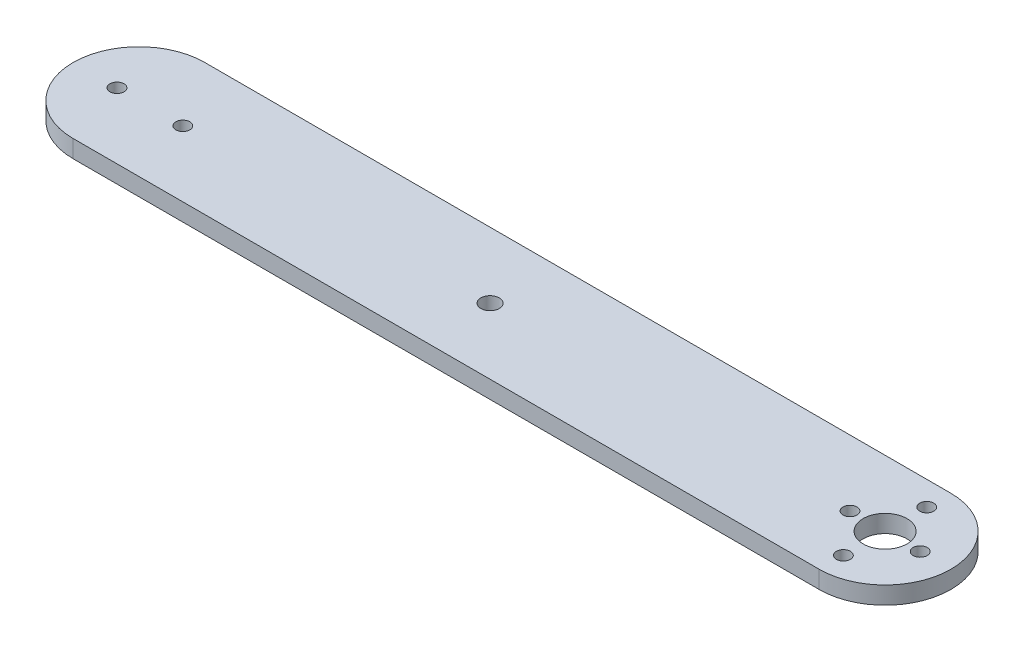
ISO-10303-21;
HEADER;
FILE_DESCRIPTION(('STEP AP214'),'2;1');
FILE_NAME('part.step','',(''),(''),'','','');
FILE_SCHEMA(('AUTOMOTIVE_DESIGN { 1 0 10303 214 1 1 1 1 }'));
ENDSEC;
DATA;
#1=APPLICATION_CONTEXT('core data for automotive mechanical design processes');
#2=APPLICATION_PROTOCOL_DEFINITION('international standard','automotive_design',2000,#1);
#3=PRODUCT_CONTEXT('',#1,'mechanical');
#4=PRODUCT('Part','Part','',(#3));
#5=PRODUCT_RELATED_PRODUCT_CATEGORY('part','',(#4));
#6=PRODUCT_DEFINITION_FORMATION('','',#4);
#7=PRODUCT_DEFINITION_CONTEXT('part definition',#1,'design');
#8=PRODUCT_DEFINITION('design','',#6,#7);
#9=PRODUCT_DEFINITION_SHAPE('','',#8);
#10=(LENGTH_UNIT() NAMED_UNIT(*) SI_UNIT(.MILLI.,.METRE.));
#11=(NAMED_UNIT(*) PLANE_ANGLE_UNIT() SI_UNIT($,.RADIAN.));
#12=(NAMED_UNIT(*) SI_UNIT($,.STERADIAN.) SOLID_ANGLE_UNIT());
#13=UNCERTAINTY_MEASURE_WITH_UNIT(LENGTH_MEASURE(1.E-05),#10,'distance_accuracy_value','');
#14=(GEOMETRIC_REPRESENTATION_CONTEXT(3) GLOBAL_UNCERTAINTY_ASSIGNED_CONTEXT((#13)) GLOBAL_UNIT_ASSIGNED_CONTEXT((#10,
#11,#12)) REPRESENTATION_CONTEXT('',''));
#15=CARTESIAN_POINT('',(0.,0.,0.));
#16=DIRECTION('',(0.,0.,1.));
#17=DIRECTION('',(1.,0.,0.));
#18=AXIS2_PLACEMENT_3D('',#15,#16,#17);
#19=CARTESIAN_POINT('',(0.,4.,0.));
#20=DIRECTION('',(0.,1.,0.));
#21=DIRECTION('',(0.,0.,1.));
#22=AXIS2_PLACEMENT_3D('',#19,#20,#21);
#23=PLANE('',#22);
#24=CARTESIAN_POINT('',(-90.,4.,0.));
#25=DIRECTION('',(0.,1.,0.));
#26=DIRECTION('',(0.,0.,1.));
#27=AXIS2_PLACEMENT_3D('',#24,#25,#26);
#28=CIRCLE('',#27,2.1);
#29=CARTESIAN_POINT('',(-90.,4.,2.1));
#30=VERTEX_POINT('',#29);
#31=EDGE_CURVE('E159',#30,#30,#28,.T.);
#32=ORIENTED_EDGE('',*,*,#31,.F.);
#33=EDGE_LOOP('',(#32));
#34=FACE_BOUND('',#33,.T.);
#35=CARTESIAN_POINT('',(-160.,4.,0.));
#36=DIRECTION('',(0.,1.,0.));
#37=DIRECTION('',(0.,0.,1.));
#38=AXIS2_PLACEMENT_3D('',#35,#36,#37);
#39=CIRCLE('',#38,1.59999999999999);
#40=CARTESIAN_POINT('',(-160.,4.,1.59999999999999));
#41=VERTEX_POINT('',#40);
#42=EDGE_CURVE('E144',#41,#41,#39,.T.);
#43=ORIENTED_EDGE('',*,*,#42,.F.);
#44=EDGE_LOOP('',(#43));
#45=FACE_BOUND('',#44,.T.);
#46=CARTESIAN_POINT('',(0.,4.,9.5));
#47=DIRECTION('',(0.,1.,0.));
#48=DIRECTION('',(0.,0.,1.));
#49=AXIS2_PLACEMENT_3D('',#46,#47,#48);
#50=CIRCLE('',#49,1.6);
#51=CARTESIAN_POINT('',(0.,4.,11.1));
#52=VERTEX_POINT('',#51);
#53=EDGE_CURVE('E134',#52,#52,#50,.T.);
#54=ORIENTED_EDGE('',*,*,#53,.F.);
#55=EDGE_LOOP('',(#54));
#56=FACE_BOUND('',#55,.T.);
#57=CARTESIAN_POINT('',(8.,4.,0.));
#58=DIRECTION('',(0.,1.,0.));
#59=DIRECTION('',(0.,0.,1.));
#60=AXIS2_PLACEMENT_3D('',#57,#58,#59);
#61=CIRCLE('',#60,1.6);
#62=CARTESIAN_POINT('',(8.,4.,1.6));
#63=VERTEX_POINT('',#62);
#64=EDGE_CURVE('E124',#63,#63,#61,.T.);
#65=ORIENTED_EDGE('',*,*,#64,.F.);
#66=EDGE_LOOP('',(#65));
#67=FACE_BOUND('',#66,.T.);
#68=CARTESIAN_POINT('',(0.,4.,0.));
#69=DIRECTION('',(0.,1.,0.));
#70=DIRECTION('',(0.,0.,1.));
#71=AXIS2_PLACEMENT_3D('',#68,#69,#70);
#72=CIRCLE('',#71,15.);
#73=CARTESIAN_POINT('',(0.,4.,15.));
#74=VERTEX_POINT('',#73);
#75=CARTESIAN_POINT('',(0.,4.,-15.));
#76=VERTEX_POINT('',#75);
#77=EDGE_CURVE('E93',#74,#76,#72,.T.);
#78=ORIENTED_EDGE('',*,*,#77,.T.);
#79=DIRECTION('',(-1.,0.,0.));
#80=VECTOR('',#79,1.);
#81=CARTESIAN_POINT('',(0.,4.,-15.));
#82=LINE('',#81,#80);
#83=CARTESIAN_POINT('',(-170.,4.,-14.9999999999999));
#84=VERTEX_POINT('',#83);
#85=EDGE_CURVE('E88',#76,#84,#82,.T.);
#86=ORIENTED_EDGE('',*,*,#85,.T.);
#87=CARTESIAN_POINT('',(-170.,4.,0.));
#88=DIRECTION('',(0.,1.,0.));
#89=DIRECTION('',(0.,0.,1.));
#90=AXIS2_PLACEMENT_3D('',#87,#88,#89);
#91=CIRCLE('',#90,15.);
#92=CARTESIAN_POINT('',(-170.,4.,15.));
#93=VERTEX_POINT('',#92);
#94=EDGE_CURVE('E90',#84,#93,#91,.T.);
#95=ORIENTED_EDGE('',*,*,#94,.T.);
#96=DIRECTION('',(1.,0.,0.));
#97=VECTOR('',#96,1.);
#98=CARTESIAN_POINT('',(0.,4.,15.));
#99=LINE('',#98,#97);
#100=EDGE_CURVE('E57',#93,#74,#99,.T.);
#101=ORIENTED_EDGE('',*,*,#100,.T.);
#102=EDGE_LOOP('',(#78,#86,#95,#101));
#103=FACE_BOUND('',#102,.T.);
#104=CARTESIAN_POINT('',(0.,4.,0.));
#105=DIRECTION('',(0.,1.,0.));
#106=DIRECTION('',(0.,0.,1.));
#107=AXIS2_PLACEMENT_3D('',#104,#105,#106);
#108=CIRCLE('',#107,5.);
#109=CARTESIAN_POINT('',(0.,4.,5.));
#110=VERTEX_POINT('',#109);
#111=EDGE_CURVE('E106',#110,#110,#108,.T.);
#112=ORIENTED_EDGE('',*,*,#111,.F.);
#113=EDGE_LOOP('',(#112));
#114=FACE_BOUND('',#113,.T.);
#115=CARTESIAN_POINT('',(0.,4.,-9.5));
#116=DIRECTION('',(0.,1.,0.));
#117=DIRECTION('',(0.,0.,1.));
#118=AXIS2_PLACEMENT_3D('',#115,#116,#117);
#119=CIRCLE('',#118,1.6);
#120=CARTESIAN_POINT('',(0.,4.,-7.9));
#121=VERTEX_POINT('',#120);
#122=EDGE_CURVE('E130',#121,#121,#119,.T.);
#123=ORIENTED_EDGE('',*,*,#122,.F.);
#124=EDGE_LOOP('',(#123));
#125=FACE_BOUND('',#124,.T.);
#126=CARTESIAN_POINT('',(-8.,4.,0.));
#127=DIRECTION('',(0.,1.,0.));
#128=DIRECTION('',(0.,0.,1.));
#129=AXIS2_PLACEMENT_3D('',#126,#127,#128);
#130=CIRCLE('',#129,1.6);
#131=CARTESIAN_POINT('',(-8.,4.,1.6));
#132=VERTEX_POINT('',#131);
#133=EDGE_CURVE('E138',#132,#132,#130,.T.);
#134=ORIENTED_EDGE('',*,*,#133,.F.);
#135=EDGE_LOOP('',(#134));
#136=FACE_BOUND('',#135,.T.);
#137=CARTESIAN_POINT('',(-175.,4.,0.));
#138=DIRECTION('',(0.,1.,0.));
#139=DIRECTION('',(0.,0.,1.));
#140=AXIS2_PLACEMENT_3D('',#137,#138,#139);
#141=CIRCLE('',#140,1.59999999999999);
#142=CARTESIAN_POINT('',(-175.,4.,1.59999999999999));
#143=VERTEX_POINT('',#142);
#144=EDGE_CURVE('E151',#143,#143,#141,.T.);
#145=ORIENTED_EDGE('',*,*,#144,.F.);
#146=EDGE_LOOP('',(#145));
#147=FACE_BOUND('',#146,.T.);
#148=ADVANCED_FACE('F39',(#34,#45,#56,#67,#103,#114,#125,#136,#147),#23,.T.);
#149=CARTESIAN_POINT('',(0.,0.,0.));
#150=DIRECTION('',(0.,1.,0.));
#151=DIRECTION('',(0.,0.,1.));
#152=AXIS2_PLACEMENT_3D('',#149,#150,#151);
#153=PLANE('',#152);
#154=CARTESIAN_POINT('',(-90.,0.,0.));
#155=DIRECTION('',(0.,1.,0.));
#156=DIRECTION('',(0.,0.,1.));
#157=AXIS2_PLACEMENT_3D('',#154,#155,#156);
#158=CIRCLE('',#157,2.1);
#159=CARTESIAN_POINT('',(-90.,0.,2.1));
#160=VERTEX_POINT('',#159);
#161=EDGE_CURVE('E160',#160,#160,#158,.T.);
#162=ORIENTED_EDGE('',*,*,#161,.T.);
#163=EDGE_LOOP('',(#162));
#164=FACE_BOUND('',#163,.T.);
#165=CARTESIAN_POINT('',(0.,0.,0.));
#166=DIRECTION('',(0.,1.,0.));
#167=DIRECTION('',(0.,0.,1.));
#168=AXIS2_PLACEMENT_3D('',#165,#166,#167);
#169=CIRCLE('',#168,15.);
#170=CARTESIAN_POINT('',(0.,0.,15.));
#171=VERTEX_POINT('',#170);
#172=CARTESIAN_POINT('',(0.,0.,-15.));
#173=VERTEX_POINT('',#172);
#174=EDGE_CURVE('E103',#171,#173,#169,.T.);
#175=ORIENTED_EDGE('',*,*,#174,.F.);
#176=DIRECTION('',(1.,0.,0.));
#177=VECTOR('',#176,1.);
#178=CARTESIAN_POINT('',(0.,0.,15.));
#179=LINE('',#178,#177);
#180=CARTESIAN_POINT('',(-170.,0.,15.));
#181=VERTEX_POINT('',#180);
#182=EDGE_CURVE('E76',#181,#171,#179,.T.);
#183=ORIENTED_EDGE('',*,*,#182,.F.);
#184=CARTESIAN_POINT('',(-170.,0.,0.));
#185=DIRECTION('',(0.,1.,0.));
#186=DIRECTION('',(0.,0.,1.));
#187=AXIS2_PLACEMENT_3D('',#184,#185,#186);
#188=CIRCLE('',#187,15.);
#189=CARTESIAN_POINT('',(-170.,0.,-14.9999999999999));
#190=VERTEX_POINT('',#189);
#191=EDGE_CURVE('E71',#190,#181,#188,.T.);
#192=ORIENTED_EDGE('',*,*,#191,.F.);
#193=DIRECTION('',(-1.,0.,0.));
#194=VECTOR('',#193,1.);
#195=CARTESIAN_POINT('',(0.,0.,-15.));
#196=LINE('',#195,#194);
#197=EDGE_CURVE('E92',#173,#190,#196,.T.);
#198=ORIENTED_EDGE('',*,*,#197,.F.);
#199=EDGE_LOOP('',(#175,#183,#192,#198));
#200=FACE_BOUND('',#199,.T.);
#201=CARTESIAN_POINT('',(0.,0.,0.));
#202=DIRECTION('',(0.,1.,0.));
#203=DIRECTION('',(0.,0.,1.));
#204=AXIS2_PLACEMENT_3D('',#201,#202,#203);
#205=CIRCLE('',#204,5.);
#206=CARTESIAN_POINT('',(0.,0.,5.));
#207=VERTEX_POINT('',#206);
#208=EDGE_CURVE('E119',#207,#207,#205,.T.);
#209=ORIENTED_EDGE('',*,*,#208,.T.);
#210=EDGE_LOOP('',(#209));
#211=FACE_BOUND('',#210,.T.);
#212=CARTESIAN_POINT('',(8.,0.,0.));
#213=DIRECTION('',(0.,1.,0.));
#214=DIRECTION('',(0.,0.,1.));
#215=AXIS2_PLACEMENT_3D('',#212,#213,#214);
#216=CIRCLE('',#215,1.6);
#217=CARTESIAN_POINT('',(8.,0.,1.6));
#218=VERTEX_POINT('',#217);
#219=EDGE_CURVE('E123',#218,#218,#216,.T.);
#220=ORIENTED_EDGE('',*,*,#219,.T.);
#221=EDGE_LOOP('',(#220));
#222=FACE_BOUND('',#221,.T.);
#223=CARTESIAN_POINT('',(0.,0.,-9.5));
#224=DIRECTION('',(0.,1.,0.));
#225=DIRECTION('',(0.,0.,1.));
#226=AXIS2_PLACEMENT_3D('',#223,#224,#225);
#227=CIRCLE('',#226,1.6);
#228=CARTESIAN_POINT('',(0.,0.,-7.9));
#229=VERTEX_POINT('',#228);
#230=EDGE_CURVE('E128',#229,#229,#227,.T.);
#231=ORIENTED_EDGE('',*,*,#230,.T.);
#232=EDGE_LOOP('',(#231));
#233=FACE_BOUND('',#232,.T.);
#234=CARTESIAN_POINT('',(0.,0.,9.5));
#235=DIRECTION('',(0.,1.,0.));
#236=DIRECTION('',(0.,0.,1.));
#237=AXIS2_PLACEMENT_3D('',#234,#235,#236);
#238=CIRCLE('',#237,1.6);
#239=CARTESIAN_POINT('',(0.,0.,11.1));
#240=VERTEX_POINT('',#239);
#241=EDGE_CURVE('E139',#240,#240,#238,.T.);
#242=ORIENTED_EDGE('',*,*,#241,.T.);
#243=EDGE_LOOP('',(#242));
#244=FACE_BOUND('',#243,.T.);
#245=CARTESIAN_POINT('',(-8.,0.,0.));
#246=DIRECTION('',(0.,1.,0.));
#247=DIRECTION('',(0.,0.,1.));
#248=AXIS2_PLACEMENT_3D('',#245,#246,#247);
#249=CIRCLE('',#248,1.6);
#250=CARTESIAN_POINT('',(-8.,0.,1.6));
#251=VERTEX_POINT('',#250);
#252=EDGE_CURVE('E142',#251,#251,#249,.T.);
#253=ORIENTED_EDGE('',*,*,#252,.T.);
#254=EDGE_LOOP('',(#253));
#255=FACE_BOUND('',#254,.T.);
#256=CARTESIAN_POINT('',(-160.,0.,0.));
#257=DIRECTION('',(0.,1.,0.));
#258=DIRECTION('',(0.,0.,1.));
#259=AXIS2_PLACEMENT_3D('',#256,#257,#258);
#260=CIRCLE('',#259,1.59999999999999);
#261=CARTESIAN_POINT('',(-160.,0.,1.59999999999999));
#262=VERTEX_POINT('',#261);
#263=EDGE_CURVE('E146',#262,#262,#260,.T.);
#264=ORIENTED_EDGE('',*,*,#263,.T.);
#265=EDGE_LOOP('',(#264));
#266=FACE_BOUND('',#265,.T.);
#267=CARTESIAN_POINT('',(-175.,0.,0.));
#268=DIRECTION('',(0.,1.,0.));
#269=DIRECTION('',(0.,0.,1.));
#270=AXIS2_PLACEMENT_3D('',#267,#268,#269);
#271=CIRCLE('',#270,1.59999999999999);
#272=CARTESIAN_POINT('',(-175.,0.,1.59999999999999));
#273=VERTEX_POINT('',#272);
#274=EDGE_CURVE('E152',#273,#273,#271,.T.);
#275=ORIENTED_EDGE('',*,*,#274,.T.);
#276=EDGE_LOOP('',(#275));
#277=FACE_BOUND('',#276,.T.);
#278=ADVANCED_FACE('F111',(#164,#200,#211,#222,#233,#244,#255,#266,#277),#153,.F.);
#279=CARTESIAN_POINT('',(0.,4.,0.));
#280=DIRECTION('',(0.,-1.,0.));
#281=DIRECTION('',(0.,0.,-1.));
#282=AXIS2_PLACEMENT_3D('',#279,#280,#281);
#283=CYLINDRICAL_SURFACE('',#282,15.);
#284=ORIENTED_EDGE('',*,*,#174,.T.);
#285=DIRECTION('',(0.,-1.,0.));
#286=VECTOR('',#285,1.);
#287=CARTESIAN_POINT('',(0.,4.,-15.));
#288=LINE('',#287,#286);
#289=EDGE_CURVE('E11',#76,#173,#288,.T.);
#290=ORIENTED_EDGE('',*,*,#289,.F.);
#291=ORIENTED_EDGE('',*,*,#77,.F.);
#292=DIRECTION('',(0.,-1.,0.));
#293=VECTOR('',#292,1.);
#294=CARTESIAN_POINT('',(0.,4.,15.));
#295=LINE('',#294,#293);
#296=EDGE_CURVE('E97',#74,#171,#295,.T.);
#297=ORIENTED_EDGE('',*,*,#296,.T.);
#298=EDGE_LOOP('',(#284,#290,#291,#297));
#299=FACE_BOUND('',#298,.T.);
#300=ADVANCED_FACE('F41',(#299),#283,.T.);
#301=CARTESIAN_POINT('',(0.,4.,-15.));
#302=DIRECTION('',(0.,0.,1.));
#303=DIRECTION('',(1.,0.,0.));
#304=AXIS2_PLACEMENT_3D('',#301,#302,#303);
#305=PLANE('',#304);
#306=ORIENTED_EDGE('',*,*,#197,.T.);
#307=DIRECTION('',(0.,-1.,0.));
#308=VECTOR('',#307,1.);
#309=CARTESIAN_POINT('',(-170.,4.,-14.9999999999999));
#310=LINE('',#309,#308);
#311=EDGE_CURVE('E48',#84,#190,#310,.T.);
#312=ORIENTED_EDGE('',*,*,#311,.F.);
#313=ORIENTED_EDGE('',*,*,#85,.F.);
#314=ORIENTED_EDGE('',*,*,#289,.T.);
#315=EDGE_LOOP('',(#306,#312,#313,#314));
#316=FACE_BOUND('',#315,.T.);
#317=ADVANCED_FACE('F94',(#316),#305,.F.);
#318=CARTESIAN_POINT('',(-170.,4.,0.));
#319=DIRECTION('',(0.,-1.,0.));
#320=DIRECTION('',(0.,0.,-1.));
#321=AXIS2_PLACEMENT_3D('',#318,#319,#320);
#322=CYLINDRICAL_SURFACE('',#321,15.);
#323=ORIENTED_EDGE('',*,*,#191,.T.);
#324=DIRECTION('',(0.,-1.,0.));
#325=VECTOR('',#324,1.);
#326=CARTESIAN_POINT('',(-170.,4.,15.));
#327=LINE('',#326,#325);
#328=EDGE_CURVE('E96',#93,#181,#327,.T.);
#329=ORIENTED_EDGE('',*,*,#328,.F.);
#330=ORIENTED_EDGE('',*,*,#94,.F.);
#331=ORIENTED_EDGE('',*,*,#311,.T.);
#332=EDGE_LOOP('',(#323,#329,#330,#331));
#333=FACE_BOUND('',#332,.T.);
#334=ADVANCED_FACE('F100',(#333),#322,.T.);
#335=CARTESIAN_POINT('',(0.,4.,15.));
#336=DIRECTION('',(0.,0.,-1.));
#337=DIRECTION('',(-1.,0.,0.));
#338=AXIS2_PLACEMENT_3D('',#335,#336,#337);
#339=PLANE('',#338);
#340=ORIENTED_EDGE('',*,*,#182,.T.);
#341=ORIENTED_EDGE('',*,*,#296,.F.);
#342=ORIENTED_EDGE('',*,*,#100,.F.);
#343=ORIENTED_EDGE('',*,*,#328,.T.);
#344=EDGE_LOOP('',(#340,#341,#342,#343));
#345=FACE_BOUND('',#344,.T.);
#346=ADVANCED_FACE('F112',(#345),#339,.F.);
#347=CARTESIAN_POINT('',(0.,4.,0.));
#348=DIRECTION('',(0.,-1.,0.));
#349=DIRECTION('',(0.,0.,-1.));
#350=AXIS2_PLACEMENT_3D('',#347,#348,#349);
#351=CYLINDRICAL_SURFACE('',#350,5.);
#352=ORIENTED_EDGE('',*,*,#111,.T.);
#353=EDGE_LOOP('',(#352));
#354=FACE_BOUND('',#353,.T.);
#355=ORIENTED_EDGE('',*,*,#208,.F.);
#356=EDGE_LOOP('',(#355));
#357=FACE_BOUND('',#356,.T.);
#358=ADVANCED_FACE('F190',(#354,#357),#351,.F.);
#359=CARTESIAN_POINT('',(8.,4.,0.));
#360=DIRECTION('',(0.,-1.,0.));
#361=DIRECTION('',(0.,0.,-1.));
#362=AXIS2_PLACEMENT_3D('',#359,#360,#361);
#363=CYLINDRICAL_SURFACE('',#362,1.6);
#364=ORIENTED_EDGE('',*,*,#64,.T.);
#365=EDGE_LOOP('',(#364));
#366=FACE_BOUND('',#365,.T.);
#367=ORIENTED_EDGE('',*,*,#219,.F.);
#368=EDGE_LOOP('',(#367));
#369=FACE_BOUND('',#368,.T.);
#370=ADVANCED_FACE('F181',(#366,#369),#363,.F.);
#371=CARTESIAN_POINT('',(0.,4.,-9.5));
#372=DIRECTION('',(0.,-1.,0.));
#373=DIRECTION('',(0.,0.,-1.));
#374=AXIS2_PLACEMENT_3D('',#371,#372,#373);
#375=CYLINDRICAL_SURFACE('',#374,1.6);
#376=ORIENTED_EDGE('',*,*,#122,.T.);
#377=EDGE_LOOP('',(#376));
#378=FACE_BOUND('',#377,.T.);
#379=ORIENTED_EDGE('',*,*,#230,.F.);
#380=EDGE_LOOP('',(#379));
#381=FACE_BOUND('',#380,.T.);
#382=ADVANCED_FACE('F187',(#378,#381),#375,.F.);
#383=CARTESIAN_POINT('',(0.,4.,9.5));
#384=DIRECTION('',(0.,-1.,0.));
#385=DIRECTION('',(0.,0.,-1.));
#386=AXIS2_PLACEMENT_3D('',#383,#384,#385);
#387=CYLINDRICAL_SURFACE('',#386,1.6);
#388=ORIENTED_EDGE('',*,*,#53,.T.);
#389=EDGE_LOOP('',(#388));
#390=FACE_BOUND('',#389,.T.);
#391=ORIENTED_EDGE('',*,*,#241,.F.);
#392=EDGE_LOOP('',(#391));
#393=FACE_BOUND('',#392,.T.);
#394=ADVANCED_FACE('F220',(#390,#393),#387,.F.);
#395=CARTESIAN_POINT('',(-8.,4.,0.));
#396=DIRECTION('',(0.,-1.,0.));
#397=DIRECTION('',(0.,0.,-1.));
#398=AXIS2_PLACEMENT_3D('',#395,#396,#397);
#399=CYLINDRICAL_SURFACE('',#398,1.6);
#400=ORIENTED_EDGE('',*,*,#133,.T.);
#401=EDGE_LOOP('',(#400));
#402=FACE_BOUND('',#401,.T.);
#403=ORIENTED_EDGE('',*,*,#252,.F.);
#404=EDGE_LOOP('',(#403));
#405=FACE_BOUND('',#404,.T.);
#406=ADVANCED_FACE('F211',(#402,#405),#399,.F.);
#407=CARTESIAN_POINT('',(-160.,4.,0.));
#408=DIRECTION('',(0.,-1.,0.));
#409=DIRECTION('',(0.,0.,-1.));
#410=AXIS2_PLACEMENT_3D('',#407,#408,#409);
#411=CYLINDRICAL_SURFACE('',#410,1.59999999999999);
#412=ORIENTED_EDGE('',*,*,#42,.T.);
#413=EDGE_LOOP('',(#412));
#414=FACE_BOUND('',#413,.T.);
#415=ORIENTED_EDGE('',*,*,#263,.F.);
#416=EDGE_LOOP('',(#415));
#417=FACE_BOUND('',#416,.T.);
#418=ADVANCED_FACE('F202',(#414,#417),#411,.F.);
#419=CARTESIAN_POINT('',(-175.,4.,0.));
#420=DIRECTION('',(0.,-1.,0.));
#421=DIRECTION('',(0.,0.,-1.));
#422=AXIS2_PLACEMENT_3D('',#419,#420,#421);
#423=CYLINDRICAL_SURFACE('',#422,1.59999999999999);
#424=ORIENTED_EDGE('',*,*,#144,.T.);
#425=EDGE_LOOP('',(#424));
#426=FACE_BOUND('',#425,.T.);
#427=ORIENTED_EDGE('',*,*,#274,.F.);
#428=EDGE_LOOP('',(#427));
#429=FACE_BOUND('',#428,.T.);
#430=ADVANCED_FACE('F168',(#426,#429),#423,.F.);
#431=CARTESIAN_POINT('',(-90.,0.,0.));
#432=DIRECTION('',(0.,1.,0.));
#433=DIRECTION('',(0.,0.,1.));
#434=AXIS2_PLACEMENT_3D('',#431,#432,#433);
#435=CYLINDRICAL_SURFACE('',#434,2.1);
#436=ORIENTED_EDGE('',*,*,#161,.F.);
#437=EDGE_LOOP('',(#436));
#438=FACE_BOUND('',#437,.T.);
#439=ORIENTED_EDGE('',*,*,#31,.T.);
#440=EDGE_LOOP('',(#439));
#441=FACE_BOUND('',#440,.T.);
#442=ADVANCED_FACE('F170',(#438,#441),#435,.F.);
#443=CLOSED_SHELL('',(#148,#278,#300,#317,#334,#346,#358,#370,#382,#394,#406,#418,#430,#442));
#444=MANIFOLD_SOLID_BREP('B2',#443);
#445=ADVANCED_BREP_SHAPE_REPRESENTATION('',(#18,#444),#14);
#446=SHAPE_DEFINITION_REPRESENTATION(#9,#445);
ENDSEC;
END-ISO-10303-21;
